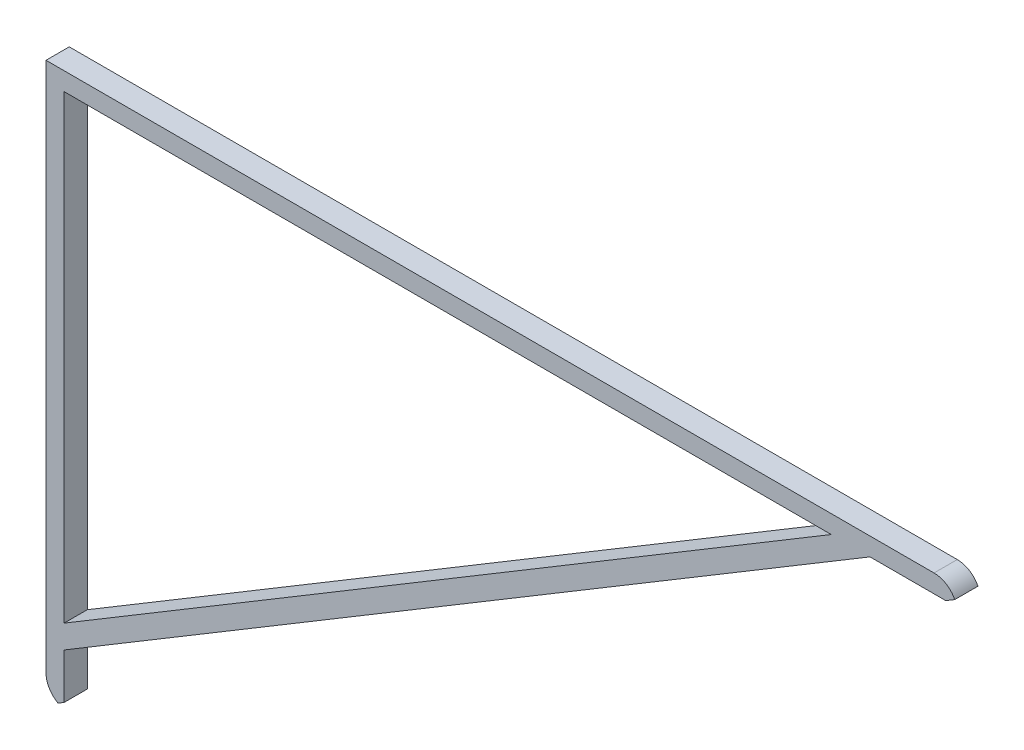
ISO-10303-21;
HEADER;
FILE_DESCRIPTION(('STEP AP214'),'2;1');
FILE_NAME('part.step','',(''),(''),'','','');
FILE_SCHEMA(('AUTOMOTIVE_DESIGN { 1 0 10303 214 1 1 1 1 }'));
ENDSEC;
DATA;
#1=APPLICATION_CONTEXT('core data for automotive mechanical design processes');
#2=APPLICATION_PROTOCOL_DEFINITION('international standard','automotive_design',2000,#1);
#3=PRODUCT_CONTEXT('',#1,'mechanical');
#4=PRODUCT('Part','Part','',(#3));
#5=PRODUCT_RELATED_PRODUCT_CATEGORY('part','',(#4));
#6=PRODUCT_DEFINITION_FORMATION('','',#4);
#7=PRODUCT_DEFINITION_CONTEXT('part definition',#1,'design');
#8=PRODUCT_DEFINITION('design','',#6,#7);
#9=PRODUCT_DEFINITION_SHAPE('','',#8);
#10=(LENGTH_UNIT() NAMED_UNIT(*) SI_UNIT(.MILLI.,.METRE.));
#11=(NAMED_UNIT(*) PLANE_ANGLE_UNIT() SI_UNIT($,.RADIAN.));
#12=(NAMED_UNIT(*) SI_UNIT($,.STERADIAN.) SOLID_ANGLE_UNIT());
#13=UNCERTAINTY_MEASURE_WITH_UNIT(LENGTH_MEASURE(1.E-05),#10,'distance_accuracy_value','');
#14=(GEOMETRIC_REPRESENTATION_CONTEXT(3) GLOBAL_UNCERTAINTY_ASSIGNED_CONTEXT((#13)) GLOBAL_UNIT_ASSIGNED_CONTEXT((#10,
#11,#12)) REPRESENTATION_CONTEXT('',''));
#15=CARTESIAN_POINT('',(0.,0.,0.));
#16=DIRECTION('',(0.,0.,1.));
#17=DIRECTION('',(1.,0.,0.));
#18=AXIS2_PLACEMENT_3D('',#15,#16,#17);
#19=CARTESIAN_POINT('',(190.98515509822,-5.,5.));
#20=DIRECTION('',(0.,0.,-1.));
#21=DIRECTION('',(-1.,0.,0.));
#22=AXIS2_PLACEMENT_3D('',#19,#20,#21);
#23=PLANE('',#22);
#24=DIRECTION('',(0.,-1.,0.));
#25=VECTOR('',#24,1.);
#26=CARTESIAN_POINT('',(0.,-114.065912898629,5.));
#27=LINE('',#26,#25);
#28=CARTESIAN_POINT('',(0.,0.,5.));
#29=VERTEX_POINT('',#28);
#30=CARTESIAN_POINT('',(0.,-114.065912898629,5.));
#31=VERTEX_POINT('',#30);
#32=EDGE_CURVE('E161',#29,#31,#27,.T.);
#33=ORIENTED_EDGE('',*,*,#32,.T.);
#34=CARTESIAN_POINT('',(5.,-114.065912898629,5.));
#35=DIRECTION('',(0.,0.,1.));
#36=DIRECTION('',(-1.,0.,0.));
#37=AXIS2_PLACEMENT_3D('',#34,#35,#36);
#38=CIRCLE('',#37,5.);
#39=CARTESIAN_POINT('',(2.58933145031181,-118.446401129813,5.));
#40=VERTEX_POINT('',#39);
#41=EDGE_CURVE('E164',#31,#40,#38,.T.);
#42=ORIENTED_EDGE('',*,*,#41,.T.);
#43=DIRECTION('',(0.857492925712546,0.514495755427523,0.));
#44=VECTOR('',#43,1.);
#45=CARTESIAN_POINT('',(3.88908729652602,-117.666547622084,5.));
#46=LINE('',#45,#44);
#47=CARTESIAN_POINT('',(3.88908729652602,-117.666547622084,5.));
#48=VERTEX_POINT('',#47);
#49=EDGE_CURVE('E167',#40,#48,#46,.T.);
#50=ORIENTED_EDGE('',*,*,#49,.T.);
#51=DIRECTION('',(0.,1.,0.));
#52=VECTOR('',#51,1.);
#53=CARTESIAN_POINT('',(3.88908729652602,-107.889087296526,5.));
#54=LINE('',#53,#52);
#55=CARTESIAN_POINT('',(3.88908729652602,-107.889087296526,5.));
#56=VERTEX_POINT('',#55);
#57=EDGE_CURVE('E169',#48,#56,#54,.T.);
#58=ORIENTED_EDGE('',*,*,#57,.T.);
#59=DIRECTION('',(0.857492925712544,0.514495755427527,0.));
#60=VECTOR('',#59,1.);
#61=CARTESIAN_POINT('',(3.88908729652602,-107.889087296526,5.));
#62=LINE('',#61,#60);
#63=CARTESIAN_POINT('',(177.222420629859,-3.88908729652601,5.));
#64=VERTEX_POINT('',#63);
#65=EDGE_CURVE('E171',#56,#64,#62,.T.);
#66=ORIENTED_EDGE('',*,*,#65,.T.);
#67=DIRECTION('',(1.,0.,0.));
#68=VECTOR('',#67,1.);
#69=CARTESIAN_POINT('',(177.222420629859,-3.88908729652601,5.));
#70=LINE('',#69,#68);
#71=CARTESIAN_POINT('',(193.518187839123,-3.88908729652601,5.));
#72=VERTEX_POINT('',#71);
#73=EDGE_CURVE('E173',#64,#72,#70,.T.);
#74=ORIENTED_EDGE('',*,*,#73,.T.);
#75=DIRECTION('',(0.857492925712527,0.514495755427554,0.));
#76=VECTOR('',#75,1.);
#77=CARTESIAN_POINT('',(195.442464427505,-2.7345213434969,5.));
#78=LINE('',#77,#76);
#79=CARTESIAN_POINT('',(195.442464427505,-2.7345213434969,5.));
#80=VERTEX_POINT('',#79);
#81=EDGE_CURVE('E175',#72,#80,#78,.T.);
#82=ORIENTED_EDGE('',*,*,#81,.T.);
#83=CARTESIAN_POINT('',(190.98515509822,-5.,5.));
#84=DIRECTION('',(0.,0.,1.));
#85=DIRECTION('',(-1.,0.,0.));
#86=AXIS2_PLACEMENT_3D('',#83,#84,#85);
#87=CIRCLE('',#86,5.);
#88=CARTESIAN_POINT('',(190.98515509822,0.,5.));
#89=VERTEX_POINT('',#88);
#90=EDGE_CURVE('E177',#80,#89,#87,.T.);
#91=ORIENTED_EDGE('',*,*,#90,.T.);
#92=DIRECTION('',(-1.,0.,0.));
#93=VECTOR('',#92,1.);
#94=CARTESIAN_POINT('',(0.,0.,5.));
#95=LINE('',#94,#93);
#96=EDGE_CURVE('E179',#89,#29,#95,.T.);
#97=ORIENTED_EDGE('',*,*,#96,.T.);
#98=EDGE_LOOP('',(#33,#42,#50,#58,#66,#74,#82,#91,#97));
#99=FACE_BOUND('',#98,.T.);
#100=DIRECTION('',(0.,-1.,0.));
#101=VECTOR('',#100,1.);
#102=CARTESIAN_POINT('',(3.88908729652601,-3.88908729652601,5.));
#103=LINE('',#102,#101);
#104=CARTESIAN_POINT('',(3.88908729652601,-3.88908729652601,5.));
#105=VERTEX_POINT('',#104);
#106=CARTESIAN_POINT('',(3.88908729652602,-102.889087296526,5.));
#107=VERTEX_POINT('',#106);
#108=EDGE_CURVE('E134',#105,#107,#103,.T.);
#109=ORIENTED_EDGE('',*,*,#108,.F.);
#110=DIRECTION('',(-1.,0.,0.));
#111=VECTOR('',#110,1.);
#112=CARTESIAN_POINT('',(3.88908729652601,-3.88908729652601,5.));
#113=LINE('',#112,#111);
#114=CARTESIAN_POINT('',(168.889087296526,-3.88908729652601,5.));
#115=VERTEX_POINT('',#114);
#116=EDGE_CURVE('E151',#115,#105,#113,.T.);
#117=ORIENTED_EDGE('',*,*,#116,.F.);
#118=DIRECTION('',(0.857492925712544,0.514495755427527,0.));
#119=VECTOR('',#118,1.);
#120=CARTESIAN_POINT('',(3.88908729652602,-102.889087296526,5.));
#121=LINE('',#120,#119);
#122=EDGE_CURVE('E142',#107,#115,#121,.T.);
#123=ORIENTED_EDGE('',*,*,#122,.F.);
#124=EDGE_LOOP('',(#109,#117,#123));
#125=FACE_BOUND('',#124,.T.);
#126=ADVANCED_FACE('F45',(#99,#125),#23,.F.);
#127=CARTESIAN_POINT('',(190.98515509822,-5.,0.));
#128=DIRECTION('',(0.,0.,-1.));
#129=DIRECTION('',(-1.,0.,0.));
#130=AXIS2_PLACEMENT_3D('',#127,#128,#129);
#131=PLANE('',#130);
#132=DIRECTION('',(0.,-1.,0.));
#133=VECTOR('',#132,1.);
#134=CARTESIAN_POINT('',(0.,-114.065912898629,0.));
#135=LINE('',#134,#133);
#136=CARTESIAN_POINT('',(0.,0.,0.));
#137=VERTEX_POINT('',#136);
#138=CARTESIAN_POINT('',(0.,-114.065912898629,0.));
#139=VERTEX_POINT('',#138);
#140=EDGE_CURVE('E149',#137,#139,#135,.T.);
#141=ORIENTED_EDGE('',*,*,#140,.F.);
#142=DIRECTION('',(-1.,0.,0.));
#143=VECTOR('',#142,1.);
#144=CARTESIAN_POINT('',(0.,0.,0.));
#145=LINE('',#144,#143);
#146=CARTESIAN_POINT('',(190.98515509822,0.,0.));
#147=VERTEX_POINT('',#146);
#148=EDGE_CURVE('E165',#147,#137,#145,.T.);
#149=ORIENTED_EDGE('',*,*,#148,.F.);
#150=CARTESIAN_POINT('',(190.98515509822,-5.,0.));
#151=DIRECTION('',(0.,0.,1.));
#152=DIRECTION('',(-1.,0.,0.));
#153=AXIS2_PLACEMENT_3D('',#150,#151,#152);
#154=CIRCLE('',#153,5.);
#155=CARTESIAN_POINT('',(195.442464427505,-2.7345213434969,0.));
#156=VERTEX_POINT('',#155);
#157=EDGE_CURVE('E196',#156,#147,#154,.T.);
#158=ORIENTED_EDGE('',*,*,#157,.F.);
#159=DIRECTION('',(0.857492925712527,0.514495755427554,0.));
#160=VECTOR('',#159,1.);
#161=CARTESIAN_POINT('',(195.442464427505,-2.7345213434969,0.));
#162=LINE('',#161,#160);
#163=CARTESIAN_POINT('',(193.518187839123,-3.88908729652601,0.));
#164=VERTEX_POINT('',#163);
#165=EDGE_CURVE('E194',#164,#156,#162,.T.);
#166=ORIENTED_EDGE('',*,*,#165,.F.);
#167=DIRECTION('',(1.,0.,0.));
#168=VECTOR('',#167,1.);
#169=CARTESIAN_POINT('',(177.222420629859,-3.88908729652601,0.));
#170=LINE('',#169,#168);
#171=CARTESIAN_POINT('',(177.222420629859,-3.88908729652601,0.));
#172=VERTEX_POINT('',#171);
#173=EDGE_CURVE('E192',#172,#164,#170,.T.);
#174=ORIENTED_EDGE('',*,*,#173,.F.);
#175=DIRECTION('',(0.857492925712544,0.514495755427527,0.));
#176=VECTOR('',#175,1.);
#177=CARTESIAN_POINT('',(3.88908729652602,-107.889087296526,0.));
#178=LINE('',#177,#176);
#179=CARTESIAN_POINT('',(3.88908729652602,-107.889087296526,0.));
#180=VERTEX_POINT('',#179);
#181=EDGE_CURVE('E190',#180,#172,#178,.T.);
#182=ORIENTED_EDGE('',*,*,#181,.F.);
#183=DIRECTION('',(0.,1.,0.));
#184=VECTOR('',#183,1.);
#185=CARTESIAN_POINT('',(3.88908729652602,-107.889087296526,0.));
#186=LINE('',#185,#184);
#187=CARTESIAN_POINT('',(3.88908729652602,-117.666547622084,0.));
#188=VERTEX_POINT('',#187);
#189=EDGE_CURVE('E188',#188,#180,#186,.T.);
#190=ORIENTED_EDGE('',*,*,#189,.F.);
#191=DIRECTION('',(0.857492925712546,0.514495755427523,0.));
#192=VECTOR('',#191,1.);
#193=CARTESIAN_POINT('',(3.88908729652602,-117.666547622084,0.));
#194=LINE('',#193,#192);
#195=CARTESIAN_POINT('',(2.58933145031181,-118.446401129813,0.));
#196=VERTEX_POINT('',#195);
#197=EDGE_CURVE('E186',#196,#188,#194,.T.);
#198=ORIENTED_EDGE('',*,*,#197,.F.);
#199=CARTESIAN_POINT('',(5.,-114.065912898629,0.));
#200=DIRECTION('',(0.,0.,1.));
#201=DIRECTION('',(-1.,0.,0.));
#202=AXIS2_PLACEMENT_3D('',#199,#200,#201);
#203=CIRCLE('',#202,5.);
#204=EDGE_CURVE('E184',#139,#196,#203,.T.);
#205=ORIENTED_EDGE('',*,*,#204,.F.);
#206=EDGE_LOOP('',(#141,#149,#158,#166,#174,#182,#190,#198,#205));
#207=FACE_BOUND('',#206,.T.);
#208=DIRECTION('',(-1.,0.,0.));
#209=VECTOR('',#208,1.);
#210=CARTESIAN_POINT('',(3.88908729652601,-3.88908729652601,0.));
#211=LINE('',#210,#209);
#212=CARTESIAN_POINT('',(168.889087296526,-3.88908729652601,0.));
#213=VERTEX_POINT('',#212);
#214=CARTESIAN_POINT('',(3.88908729652601,-3.88908729652601,0.));
#215=VERTEX_POINT('',#214);
#216=EDGE_CURVE('E143',#213,#215,#211,.T.);
#217=ORIENTED_EDGE('',*,*,#216,.T.);
#218=DIRECTION('',(0.,-1.,0.));
#219=VECTOR('',#218,1.);
#220=CARTESIAN_POINT('',(3.88908729652601,-3.88908729652601,0.));
#221=LINE('',#220,#219);
#222=CARTESIAN_POINT('',(3.88908729652602,-102.889087296526,0.));
#223=VERTEX_POINT('',#222);
#224=EDGE_CURVE('E68',#215,#223,#221,.T.);
#225=ORIENTED_EDGE('',*,*,#224,.T.);
#226=DIRECTION('',(0.857492925712544,0.514495755427527,0.));
#227=VECTOR('',#226,1.);
#228=CARTESIAN_POINT('',(3.88908729652602,-102.889087296526,0.));
#229=LINE('',#228,#227);
#230=EDGE_CURVE('E148',#223,#213,#229,.T.);
#231=ORIENTED_EDGE('',*,*,#230,.T.);
#232=EDGE_LOOP('',(#217,#225,#231));
#233=FACE_BOUND('',#232,.T.);
#234=ADVANCED_FACE('F229',(#207,#233),#131,.T.);
#235=CARTESIAN_POINT('',(0.,-114.065912898629,5.));
#236=DIRECTION('',(1.,0.,0.));
#237=DIRECTION('',(0.,0.,-1.));
#238=AXIS2_PLACEMENT_3D('',#235,#236,#237);
#239=PLANE('',#238);
#240=ORIENTED_EDGE('',*,*,#140,.T.);
#241=DIRECTION('',(0.,0.,-1.));
#242=VECTOR('',#241,1.);
#243=CARTESIAN_POINT('',(0.,-114.065912898629,5.));
#244=LINE('',#243,#242);
#245=EDGE_CURVE('E11',#31,#139,#244,.T.);
#246=ORIENTED_EDGE('',*,*,#245,.F.);
#247=ORIENTED_EDGE('',*,*,#32,.F.);
#248=DIRECTION('',(0.,0.,-1.));
#249=VECTOR('',#248,1.);
#250=CARTESIAN_POINT('',(0.,0.,5.));
#251=LINE('',#250,#249);
#252=EDGE_CURVE('E181',#29,#137,#251,.T.);
#253=ORIENTED_EDGE('',*,*,#252,.T.);
#254=EDGE_LOOP('',(#240,#246,#247,#253));
#255=FACE_BOUND('',#254,.T.);
#256=ADVANCED_FACE('F47',(#255),#239,.F.);
#257=CARTESIAN_POINT('',(5.,-114.065912898629,5.));
#258=DIRECTION('',(0.,0.,-1.));
#259=DIRECTION('',(-1.,0.,0.));
#260=AXIS2_PLACEMENT_3D('',#257,#258,#259);
#261=CYLINDRICAL_SURFACE('',#260,5.);
#262=ORIENTED_EDGE('',*,*,#204,.T.);
#263=DIRECTION('',(0.,0.,-1.));
#264=VECTOR('',#263,1.);
#265=CARTESIAN_POINT('',(2.58933145031181,-118.446401129813,5.));
#266=LINE('',#265,#264);
#267=EDGE_CURVE('E53',#40,#196,#266,.T.);
#268=ORIENTED_EDGE('',*,*,#267,.F.);
#269=ORIENTED_EDGE('',*,*,#41,.F.);
#270=ORIENTED_EDGE('',*,*,#245,.T.);
#271=EDGE_LOOP('',(#262,#268,#269,#270));
#272=FACE_BOUND('',#271,.T.);
#273=ADVANCED_FACE('F246',(#272),#261,.T.);
#274=CARTESIAN_POINT('',(3.88908729652602,-117.666547622084,5.));
#275=DIRECTION('',(-0.514495755427523,0.857492925712546,0.));
#276=DIRECTION('',(-0.857492925712547,-0.514495755427523,0.));
#277=AXIS2_PLACEMENT_3D('',#274,#275,#276);
#278=PLANE('',#277);
#279=ORIENTED_EDGE('',*,*,#197,.T.);
#280=DIRECTION('',(0.,0.,-1.));
#281=VECTOR('',#280,1.);
#282=CARTESIAN_POINT('',(3.88908729652602,-117.666547622084,5.));
#283=LINE('',#282,#281);
#284=EDGE_CURVE('E216',#48,#188,#283,.T.);
#285=ORIENTED_EDGE('',*,*,#284,.F.);
#286=ORIENTED_EDGE('',*,*,#49,.F.);
#287=ORIENTED_EDGE('',*,*,#267,.T.);
#288=EDGE_LOOP('',(#279,#285,#286,#287));
#289=FACE_BOUND('',#288,.T.);
#290=ADVANCED_FACE('F223',(#289),#278,.F.);
#291=CARTESIAN_POINT('',(3.88908729652602,-107.889087296526,5.));
#292=DIRECTION('',(-1.,0.,0.));
#293=DIRECTION('',(0.,-1.,0.));
#294=AXIS2_PLACEMENT_3D('',#291,#292,#293);
#295=PLANE('',#294);
#296=ORIENTED_EDGE('',*,*,#189,.T.);
#297=DIRECTION('',(0.,0.,-1.));
#298=VECTOR('',#297,1.);
#299=CARTESIAN_POINT('',(3.88908729652602,-107.889087296526,5.));
#300=LINE('',#299,#298);
#301=EDGE_CURVE('E213',#56,#180,#300,.T.);
#302=ORIENTED_EDGE('',*,*,#301,.F.);
#303=ORIENTED_EDGE('',*,*,#57,.F.);
#304=ORIENTED_EDGE('',*,*,#284,.T.);
#305=EDGE_LOOP('',(#296,#302,#303,#304));
#306=FACE_BOUND('',#305,.T.);
#307=ADVANCED_FACE('F235',(#306),#295,.F.);
#308=CARTESIAN_POINT('',(3.88908729652602,-107.889087296526,5.));
#309=DIRECTION('',(-0.514495755427527,0.857492925712544,0.));
#310=DIRECTION('',(-0.857492925712544,-0.514495755427527,0.));
#311=AXIS2_PLACEMENT_3D('',#308,#309,#310);
#312=PLANE('',#311);
#313=ORIENTED_EDGE('',*,*,#181,.T.);
#314=DIRECTION('',(0.,0.,-1.));
#315=VECTOR('',#314,1.);
#316=CARTESIAN_POINT('',(177.222420629859,-3.88908729652601,5.));
#317=LINE('',#316,#315);
#318=EDGE_CURVE('E210',#64,#172,#317,.T.);
#319=ORIENTED_EDGE('',*,*,#318,.F.);
#320=ORIENTED_EDGE('',*,*,#65,.F.);
#321=ORIENTED_EDGE('',*,*,#301,.T.);
#322=EDGE_LOOP('',(#313,#319,#320,#321));
#323=FACE_BOUND('',#322,.T.);
#324=ADVANCED_FACE('F239',(#323),#312,.F.);
#325=CARTESIAN_POINT('',(177.222420629859,-3.88908729652601,5.));
#326=DIRECTION('',(0.,1.,0.));
#327=DIRECTION('',(0.,0.,1.));
#328=AXIS2_PLACEMENT_3D('',#325,#326,#327);
#329=PLANE('',#328);
#330=ORIENTED_EDGE('',*,*,#173,.T.);
#331=DIRECTION('',(0.,0.,-1.));
#332=VECTOR('',#331,1.);
#333=CARTESIAN_POINT('',(193.518187839123,-3.88908729652601,5.));
#334=LINE('',#333,#332);
#335=EDGE_CURVE('E207',#72,#164,#334,.T.);
#336=ORIENTED_EDGE('',*,*,#335,.F.);
#337=ORIENTED_EDGE('',*,*,#73,.F.);
#338=ORIENTED_EDGE('',*,*,#318,.T.);
#339=EDGE_LOOP('',(#330,#336,#337,#338));
#340=FACE_BOUND('',#339,.T.);
#341=ADVANCED_FACE('F264',(#340),#329,.F.);
#342=CARTESIAN_POINT('',(195.442464427505,-2.7345213434969,5.));
#343=DIRECTION('',(-0.514495755427554,0.857492925712527,0.));
#344=DIRECTION('',(-0.857492925712527,-0.514495755427554,0.));
#345=AXIS2_PLACEMENT_3D('',#342,#343,#344);
#346=PLANE('',#345);
#347=ORIENTED_EDGE('',*,*,#165,.T.);
#348=DIRECTION('',(0.,0.,-1.));
#349=VECTOR('',#348,1.);
#350=CARTESIAN_POINT('',(195.442464427505,-2.7345213434969,5.));
#351=LINE('',#350,#349);
#352=EDGE_CURVE('E204',#80,#156,#351,.T.);
#353=ORIENTED_EDGE('',*,*,#352,.F.);
#354=ORIENTED_EDGE('',*,*,#81,.F.);
#355=ORIENTED_EDGE('',*,*,#335,.T.);
#356=EDGE_LOOP('',(#347,#353,#354,#355));
#357=FACE_BOUND('',#356,.T.);
#358=ADVANCED_FACE('F262',(#357),#346,.F.);
#359=CARTESIAN_POINT('',(190.98515509822,-5.,5.));
#360=DIRECTION('',(0.,0.,-1.));
#361=DIRECTION('',(-1.,0.,0.));
#362=AXIS2_PLACEMENT_3D('',#359,#360,#361);
#363=CYLINDRICAL_SURFACE('',#362,5.);
#364=ORIENTED_EDGE('',*,*,#157,.T.);
#365=DIRECTION('',(0.,0.,-1.));
#366=VECTOR('',#365,1.);
#367=CARTESIAN_POINT('',(190.98515509822,0.,5.));
#368=LINE('',#367,#366);
#369=EDGE_CURVE('E201',#89,#147,#368,.T.);
#370=ORIENTED_EDGE('',*,*,#369,.F.);
#371=ORIENTED_EDGE('',*,*,#90,.F.);
#372=ORIENTED_EDGE('',*,*,#352,.T.);
#373=EDGE_LOOP('',(#364,#370,#371,#372));
#374=FACE_BOUND('',#373,.T.);
#375=ADVANCED_FACE('F258',(#374),#363,.T.);
#376=CARTESIAN_POINT('',(0.,0.,5.));
#377=DIRECTION('',(0.,-1.,0.));
#378=DIRECTION('',(0.,0.,-1.));
#379=AXIS2_PLACEMENT_3D('',#376,#377,#378);
#380=PLANE('',#379);
#381=ORIENTED_EDGE('',*,*,#148,.T.);
#382=ORIENTED_EDGE('',*,*,#252,.F.);
#383=ORIENTED_EDGE('',*,*,#96,.F.);
#384=ORIENTED_EDGE('',*,*,#369,.T.);
#385=EDGE_LOOP('',(#381,#382,#383,#384));
#386=FACE_BOUND('',#385,.T.);
#387=ADVANCED_FACE('F253',(#386),#380,.F.);
#388=CARTESIAN_POINT('',(3.88908729652601,-3.88908729652601,5.));
#389=DIRECTION('',(1.,0.,0.));
#390=DIRECTION('',(0.,1.,0.));
#391=AXIS2_PLACEMENT_3D('',#388,#389,#390);
#392=PLANE('',#391);
#393=ORIENTED_EDGE('',*,*,#224,.F.);
#394=DIRECTION('',(0.,0.,-1.));
#395=VECTOR('',#394,1.);
#396=CARTESIAN_POINT('',(3.88908729652601,-3.88908729652601,5.));
#397=LINE('',#396,#395);
#398=EDGE_CURVE('E138',#105,#215,#397,.T.);
#399=ORIENTED_EDGE('',*,*,#398,.F.);
#400=ORIENTED_EDGE('',*,*,#108,.T.);
#401=DIRECTION('',(0.,0.,-1.));
#402=VECTOR('',#401,1.);
#403=CARTESIAN_POINT('',(3.88908729652602,-102.889087296526,5.));
#404=LINE('',#403,#402);
#405=EDGE_CURVE('E137',#107,#223,#404,.T.);
#406=ORIENTED_EDGE('',*,*,#405,.T.);
#407=EDGE_LOOP('',(#393,#399,#400,#406));
#408=FACE_BOUND('',#407,.T.);
#409=ADVANCED_FACE('F136',(#408),#392,.T.);
#410=CARTESIAN_POINT('',(3.88908729652602,-102.889087296526,5.));
#411=DIRECTION('',(-0.514495755427527,0.857492925712544,0.));
#412=DIRECTION('',(-0.857492925712544,-0.514495755427527,0.));
#413=AXIS2_PLACEMENT_3D('',#410,#411,#412);
#414=PLANE('',#413);
#415=ORIENTED_EDGE('',*,*,#230,.F.);
#416=ORIENTED_EDGE('',*,*,#405,.F.);
#417=ORIENTED_EDGE('',*,*,#122,.T.);
#418=DIRECTION('',(0.,0.,-1.));
#419=VECTOR('',#418,1.);
#420=CARTESIAN_POINT('',(168.889087296526,-3.88908729652601,5.));
#421=LINE('',#420,#419);
#422=EDGE_CURVE('E60',#115,#213,#421,.T.);
#423=ORIENTED_EDGE('',*,*,#422,.T.);
#424=EDGE_LOOP('',(#415,#416,#417,#423));
#425=FACE_BOUND('',#424,.T.);
#426=ADVANCED_FACE('F146',(#425),#414,.T.);
#427=CARTESIAN_POINT('',(3.88908729652601,-3.88908729652601,5.));
#428=DIRECTION('',(0.,-1.,0.));
#429=DIRECTION('',(0.,0.,-1.));
#430=AXIS2_PLACEMENT_3D('',#427,#428,#429);
#431=PLANE('',#430);
#432=ORIENTED_EDGE('',*,*,#216,.F.);
#433=ORIENTED_EDGE('',*,*,#422,.F.);
#434=ORIENTED_EDGE('',*,*,#116,.T.);
#435=ORIENTED_EDGE('',*,*,#398,.T.);
#436=EDGE_LOOP('',(#432,#433,#434,#435));
#437=FACE_BOUND('',#436,.T.);
#438=ADVANCED_FACE('F307',(#437),#431,.T.);
#439=CLOSED_SHELL('',(#126,#234,#256,#273,#290,#307,#324,#341,#358,#375,#387,#409,#426,#438));
#440=MANIFOLD_SOLID_BREP('B2',#439);
#441=ADVANCED_BREP_SHAPE_REPRESENTATION('',(#18,#440),#14);
#442=SHAPE_DEFINITION_REPRESENTATION(#9,#441);
ENDSEC;
END-ISO-10303-21;
